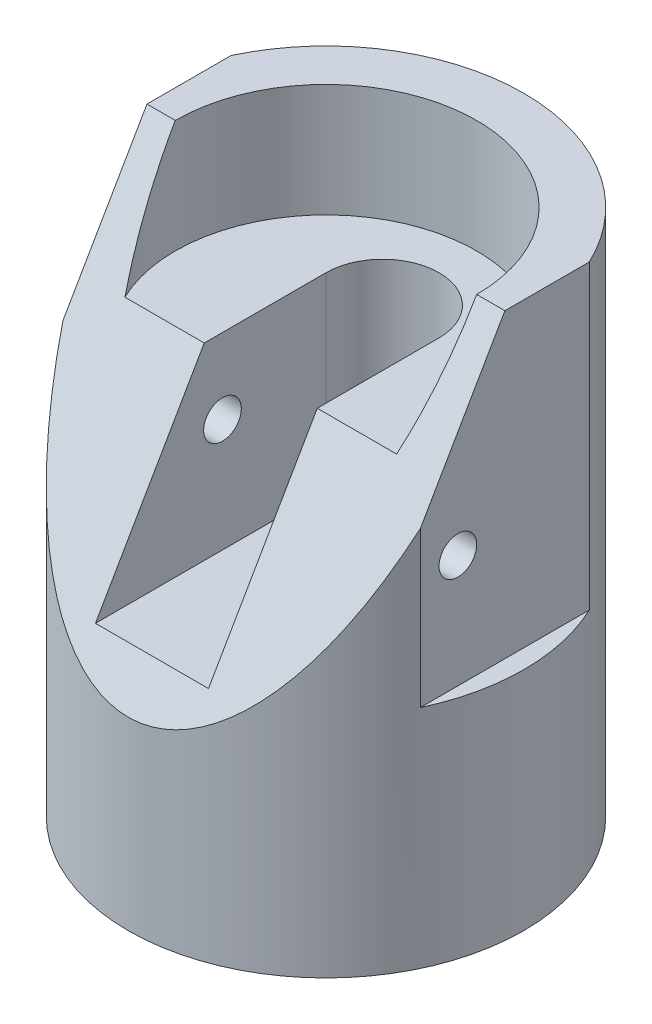
ISO-10303-21;
HEADER;
FILE_DESCRIPTION(('STEP AP214'),'2;1');
FILE_NAME('part.step','',(''),(''),'','','');
FILE_SCHEMA(('AUTOMOTIVE_DESIGN { 1 0 10303 214 1 1 1 1 }'));
ENDSEC;
DATA;
#1=APPLICATION_CONTEXT('core data for automotive mechanical design processes');
#2=APPLICATION_PROTOCOL_DEFINITION('international standard','automotive_design',2000,#1);
#3=PRODUCT_CONTEXT('',#1,'mechanical');
#4=PRODUCT('Part','Part','',(#3));
#5=PRODUCT_RELATED_PRODUCT_CATEGORY('part','',(#4));
#6=PRODUCT_DEFINITION_FORMATION('','',#4);
#7=PRODUCT_DEFINITION_CONTEXT('part definition',#1,'design');
#8=PRODUCT_DEFINITION('design','',#6,#7);
#9=PRODUCT_DEFINITION_SHAPE('','',#8);
#10=(LENGTH_UNIT() NAMED_UNIT(*) SI_UNIT(.MILLI.,.METRE.));
#11=(NAMED_UNIT(*) PLANE_ANGLE_UNIT() SI_UNIT($,.RADIAN.));
#12=(NAMED_UNIT(*) SI_UNIT($,.STERADIAN.) SOLID_ANGLE_UNIT());
#13=UNCERTAINTY_MEASURE_WITH_UNIT(LENGTH_MEASURE(1.E-05),#10,'distance_accuracy_value','');
#14=(GEOMETRIC_REPRESENTATION_CONTEXT(3) GLOBAL_UNCERTAINTY_ASSIGNED_CONTEXT((#13)) GLOBAL_UNIT_ASSIGNED_CONTEXT((#10,
#11,#12)) REPRESENTATION_CONTEXT('',''));
#15=CARTESIAN_POINT('',(0.,0.,0.));
#16=DIRECTION('',(0.,0.,1.));
#17=DIRECTION('',(1.,0.,0.));
#18=AXIS2_PLACEMENT_3D('',#15,#16,#17);
#19=CARTESIAN_POINT('',(33.3375,31.1577562026728,33.3375));
#20=DIRECTION('',(0.,-0.500000000000001,-0.866025403784438));
#21=DIRECTION('',(0.,0.866025403784438,-0.500000000000001));
#22=AXIS2_PLACEMENT_3D('',#19,#20,#21);
#23=PLANE('',#22);
#24=DIRECTION('',(-1.,0.,0.));
#25=VECTOR('',#24,1.);
#26=CARTESIAN_POINT('',(33.3375,88.9,0.));
#27=LINE('',#26,#25);
#28=CARTESIAN_POINT('',(-25.4,88.9,0.));
#29=VERTEX_POINT('',#28);
#30=CARTESIAN_POINT('',(-30.1752,88.9,0.));
#31=VERTEX_POINT('',#30);
#32=EDGE_CURVE('E191',#29,#31,#27,.T.);
#33=ORIENTED_EDGE('',*,*,#32,.T.);
#34=DIRECTION('',(0.,-0.866025403784438,0.500000000000001));
#35=VECTOR('',#34,1.);
#36=CARTESIAN_POINT('',(-30.1752,31.1577562026728,33.3375));
#37=LINE('',#36,#35);
#38=CARTESIAN_POINT('',(-30.1752,64.3533376274901,14.1720221284755));
#39=VERTEX_POINT('',#38);
#40=EDGE_CURVE('E153',#31,#39,#37,.T.);
#41=ORIENTED_EDGE('',*,*,#40,.T.);
#42=CARTESIAN_POINT('',(0.,88.9,0.));
#43=DIRECTION('',(0.,-0.500000000000001,-0.866025403784438));
#44=DIRECTION('',(0.,-0.866025403784438,0.500000000000001));
#45=AXIS2_PLACEMENT_3D('',#42,#43,#44);
#46=ELLIPSE('',#45,66.6749999999998,33.3375);
#47=CARTESIAN_POINT('',(30.1498,64.2598823332762,14.2259785677471));
#48=VERTEX_POINT('',#47);
#49=EDGE_CURVE('E135',#48,#39,#46,.T.);
#50=ORIENTED_EDGE('',*,*,#49,.F.);
#51=DIRECTION('',(0.,0.866025403784438,-0.500000000000001));
#52=VECTOR('',#51,1.);
#53=CARTESIAN_POINT('',(30.1498,31.1577562026728,33.3375));
#54=LINE('',#53,#52);
#55=CARTESIAN_POINT('',(30.1498,88.9,0.));
#56=VERTEX_POINT('',#55);
#57=EDGE_CURVE('E137',#48,#56,#54,.T.);
#58=ORIENTED_EDGE('',*,*,#57,.T.);
#59=CARTESIAN_POINT('',(25.4,88.9,0.));
#60=VERTEX_POINT('',#59);
#61=EDGE_CURVE('E195',#56,#60,#27,.T.);
#62=ORIENTED_EDGE('',*,*,#61,.T.);
#63=CARTESIAN_POINT('',(0.,88.9,0.));
#64=DIRECTION('',(0.,-0.500000000000001,-0.866025403784438));
#65=DIRECTION('',(0.,0.866025403784438,-0.500000000000001));
#66=AXIS2_PLACEMENT_3D('',#63,#64,#65);
#67=ELLIPSE('',#66,50.7999999999999,25.4);
#68=CARTESIAN_POINT('',(22.8952505991963,69.85,10.9985226280624));
#69=VERTEX_POINT('',#68);
#70=EDGE_CURVE('E187',#60,#69,#67,.T.);
#71=ORIENTED_EDGE('',*,*,#70,.T.);
#72=DIRECTION('',(1.,0.,0.));
#73=VECTOR('',#72,1.);
#74=CARTESIAN_POINT('',(33.3375,69.85,10.9985226280624));
#75=LINE('',#74,#73);
#76=CARTESIAN_POINT('',(9.525,69.85,10.9985226280624));
#77=VERTEX_POINT('',#76);
#78=EDGE_CURVE('E198',#77,#69,#75,.T.);
#79=ORIENTED_EDGE('',*,*,#78,.F.);
#80=DIRECTION('',(0.,-0.866025403784438,0.500000000000001));
#81=VECTOR('',#80,1.);
#82=CARTESIAN_POINT('',(9.525,31.1577562026728,33.3375));
#83=LINE('',#82,#81);
#84=CARTESIAN_POINT('',(9.525,38.1,29.3293936748331));
#85=VERTEX_POINT('',#84);
#86=EDGE_CURVE('E176',#77,#85,#83,.T.);
#87=ORIENTED_EDGE('',*,*,#86,.T.);
#88=DIRECTION('',(1.,0.,0.));
#89=VECTOR('',#88,1.);
#90=CARTESIAN_POINT('',(33.3375,38.1,29.3293936748331));
#91=LINE('',#90,#89);
#92=CARTESIAN_POINT('',(-9.525,38.1,29.3293936748331));
#93=VERTEX_POINT('',#92);
#94=EDGE_CURVE('E12',#93,#85,#91,.T.);
#95=ORIENTED_EDGE('',*,*,#94,.F.);
#96=DIRECTION('',(0.,0.866025403784438,-0.500000000000001));
#97=VECTOR('',#96,1.);
#98=CARTESIAN_POINT('',(-9.525,31.1577562026728,33.3375));
#99=LINE('',#98,#97);
#100=CARTESIAN_POINT('',(-9.525,69.85,10.9985226280624));
#101=VERTEX_POINT('',#100);
#102=EDGE_CURVE('E171',#93,#101,#99,.T.);
#103=ORIENTED_EDGE('',*,*,#102,.T.);
#104=CARTESIAN_POINT('',(-22.8952505991963,69.85,10.9985226280624));
#105=VERTEX_POINT('',#104);
#106=EDGE_CURVE('E199',#105,#101,#75,.T.);
#107=ORIENTED_EDGE('',*,*,#106,.F.);
#108=EDGE_CURVE('E183',#105,#29,#67,.T.);
#109=ORIENTED_EDGE('',*,*,#108,.T.);
#110=EDGE_LOOP('',(#33,#41,#50,#58,#62,#71,#79,#87,#95,#103,#107,#109));
#111=FACE_BOUND('',#110,.T.);
#112=ADVANCED_FACE('F37',(#111),#23,.F.);
#113=CARTESIAN_POINT('',(0.,88.9,0.));
#114=DIRECTION('',(0.,1.,0.));
#115=DIRECTION('',(0.,0.,1.));
#116=AXIS2_PLACEMENT_3D('',#113,#114,#115);
#117=PLANE('',#116);
#118=DIRECTION('',(0.,0.,-1.));
#119=VECTOR('',#118,1.);
#120=CARTESIAN_POINT('',(-30.1752,88.9,-14.1720221284755));
#121=LINE('',#120,#119);
#122=CARTESIAN_POINT('',(-30.1752,88.9,-14.1720221284755));
#123=VERTEX_POINT('',#122);
#124=EDGE_CURVE('E122',#31,#123,#121,.T.);
#125=ORIENTED_EDGE('',*,*,#124,.F.);
#126=ORIENTED_EDGE('',*,*,#32,.F.);
#127=CARTESIAN_POINT('',(0.,88.9,0.));
#128=DIRECTION('',(0.,1.,0.));
#129=DIRECTION('',(0.,0.,1.));
#130=AXIS2_PLACEMENT_3D('',#127,#128,#129);
#131=CIRCLE('',#130,25.4);
#132=EDGE_CURVE('E179',#60,#29,#131,.T.);
#133=ORIENTED_EDGE('',*,*,#132,.F.);
#134=ORIENTED_EDGE('',*,*,#61,.F.);
#135=DIRECTION('',(0.,0.,1.));
#136=VECTOR('',#135,1.);
#137=CARTESIAN_POINT('',(30.1498,88.9,-14.2259785677471));
#138=LINE('',#137,#136);
#139=CARTESIAN_POINT('',(30.1498,88.9,-14.2259785677471));
#140=VERTEX_POINT('',#139);
#141=EDGE_CURVE('E143',#140,#56,#138,.T.);
#142=ORIENTED_EDGE('',*,*,#141,.F.);
#143=CARTESIAN_POINT('',(0.,88.9,0.));
#144=DIRECTION('',(0.,-1.,0.));
#145=DIRECTION('',(0.,0.,-1.));
#146=AXIS2_PLACEMENT_3D('',#143,#144,#145);
#147=CIRCLE('',#146,33.3375);
#148=EDGE_CURVE('E188',#123,#140,#147,.T.);
#149=ORIENTED_EDGE('',*,*,#148,.F.);
#150=EDGE_LOOP('',(#125,#126,#133,#134,#142,#149));
#151=FACE_BOUND('',#150,.T.);
#152=ADVANCED_FACE('F236',(#151),#117,.T.);
#153=CARTESIAN_POINT('',(0.,88.9,0.));
#154=DIRECTION('',(0.,-1.,0.));
#155=DIRECTION('',(0.,0.,-1.));
#156=AXIS2_PLACEMENT_3D('',#153,#154,#155);
#157=CYLINDRICAL_SURFACE('',#156,33.3375);
#158=DIRECTION('',(0.,1.,0.));
#159=VECTOR('',#158,1.);
#160=CARTESIAN_POINT('',(-30.1752,38.1,14.1720221284755));
#161=LINE('',#160,#159);
#162=CARTESIAN_POINT('',(-30.1752,38.1,14.1720221284755));
#163=VERTEX_POINT('',#162);
#164=EDGE_CURVE('E126',#163,#39,#161,.T.);
#165=ORIENTED_EDGE('',*,*,#164,.F.);
#166=CARTESIAN_POINT('',(0.,38.1,0.));
#167=DIRECTION('',(0.,1.,0.));
#168=DIRECTION('',(0.,0.,1.));
#169=AXIS2_PLACEMENT_3D('',#166,#167,#168);
#170=CIRCLE('',#169,33.3375);
#171=CARTESIAN_POINT('',(-30.1752,38.1,-14.1720221284755));
#172=VERTEX_POINT('',#171);
#173=EDGE_CURVE('E117',#172,#163,#170,.T.);
#174=ORIENTED_EDGE('',*,*,#173,.F.);
#175=DIRECTION('',(0.,1.,0.));
#176=VECTOR('',#175,1.);
#177=CARTESIAN_POINT('',(-30.1752,38.1,-14.1720221284755));
#178=LINE('',#177,#176);
#179=EDGE_CURVE('E128',#172,#123,#178,.T.);
#180=ORIENTED_EDGE('',*,*,#179,.T.);
#181=ORIENTED_EDGE('',*,*,#148,.T.);
#182=DIRECTION('',(0.,1.,0.));
#183=VECTOR('',#182,1.);
#184=CARTESIAN_POINT('',(30.1498,38.1,-14.2259785677471));
#185=LINE('',#184,#183);
#186=CARTESIAN_POINT('',(30.1498,38.1,-14.2259785677471));
#187=VERTEX_POINT('',#186);
#188=EDGE_CURVE('E145',#187,#140,#185,.T.);
#189=ORIENTED_EDGE('',*,*,#188,.F.);
#190=CARTESIAN_POINT('',(0.,38.1,0.));
#191=DIRECTION('',(0.,1.,0.));
#192=DIRECTION('',(0.,0.,1.));
#193=AXIS2_PLACEMENT_3D('',#190,#191,#192);
#194=CIRCLE('',#193,33.3375);
#195=CARTESIAN_POINT('',(30.1498,38.1,14.2259785677471));
#196=VERTEX_POINT('',#195);
#197=EDGE_CURVE('E141',#196,#187,#194,.T.);
#198=ORIENTED_EDGE('',*,*,#197,.F.);
#199=DIRECTION('',(0.,1.,0.));
#200=VECTOR('',#199,1.);
#201=CARTESIAN_POINT('',(30.1498,38.1,14.2259785677471));
#202=LINE('',#201,#200);
#203=EDGE_CURVE('E148',#196,#48,#202,.T.);
#204=ORIENTED_EDGE('',*,*,#203,.T.);
#205=ORIENTED_EDGE('',*,*,#49,.T.);
#206=EDGE_LOOP('',(#165,#174,#180,#181,#189,#198,#204,#205));
#207=FACE_BOUND('',#206,.T.);
#208=CARTESIAN_POINT('',(0.,0.,0.));
#209=DIRECTION('',(0.,-1.,0.));
#210=DIRECTION('',(0.,0.,-1.));
#211=AXIS2_PLACEMENT_3D('',#208,#209,#210);
#212=CIRCLE('',#211,33.3375);
#213=CARTESIAN_POINT('',(0.,0.,-33.3375));
#214=VERTEX_POINT('',#213);
#215=EDGE_CURVE('E192',#214,#214,#212,.T.);
#216=ORIENTED_EDGE('',*,*,#215,.F.);
#217=EDGE_LOOP('',(#216));
#218=FACE_BOUND('',#217,.T.);
#219=ADVANCED_FACE('F131',(#207,#218),#157,.T.);
#220=CARTESIAN_POINT('',(0.,0.,0.));
#221=DIRECTION('',(0.,1.,0.));
#222=DIRECTION('',(0.,0.,1.));
#223=AXIS2_PLACEMENT_3D('',#220,#221,#222);
#224=PLANE('',#223);
#225=ORIENTED_EDGE('',*,*,#215,.T.);
#226=EDGE_LOOP('',(#225));
#227=FACE_BOUND('',#226,.T.);
#228=ADVANCED_FACE('F39',(#227),#224,.F.);
#229=CARTESIAN_POINT('',(0.,69.85,0.));
#230=DIRECTION('',(0.,1.,0.));
#231=DIRECTION('',(0.,0.,1.));
#232=AXIS2_PLACEMENT_3D('',#229,#230,#231);
#233=PLANE('',#232);
#234=DIRECTION('',(0.,0.,-1.));
#235=VECTOR('',#234,1.);
#236=CARTESIAN_POINT('',(9.525,69.85,0.));
#237=LINE('',#236,#235);
#238=CARTESIAN_POINT('',(9.525,69.85,-9.525));
#239=VERTEX_POINT('',#238);
#240=EDGE_CURVE('E45',#77,#239,#237,.T.);
#241=ORIENTED_EDGE('',*,*,#240,.F.);
#242=ORIENTED_EDGE('',*,*,#78,.T.);
#243=CARTESIAN_POINT('',(0.,69.85,0.));
#244=DIRECTION('',(0.,1.,0.));
#245=DIRECTION('',(0.,0.,1.));
#246=AXIS2_PLACEMENT_3D('',#243,#244,#245);
#247=CIRCLE('',#246,25.4);
#248=EDGE_CURVE('E180',#69,#105,#247,.T.);
#249=ORIENTED_EDGE('',*,*,#248,.T.);
#250=ORIENTED_EDGE('',*,*,#106,.T.);
#251=DIRECTION('',(0.,0.,1.));
#252=VECTOR('',#251,1.);
#253=CARTESIAN_POINT('',(-9.525,69.85,-9.525));
#254=LINE('',#253,#252);
#255=CARTESIAN_POINT('',(-9.525,69.85,-9.525));
#256=VERTEX_POINT('',#255);
#257=EDGE_CURVE('E160',#256,#101,#254,.T.);
#258=ORIENTED_EDGE('',*,*,#257,.F.);
#259=CARTESIAN_POINT('',(0.,69.85,-9.525));
#260=DIRECTION('',(0.,1.,0.));
#261=DIRECTION('',(0.,0.,1.));
#262=AXIS2_PLACEMENT_3D('',#259,#260,#261);
#263=CIRCLE('',#262,9.525);
#264=EDGE_CURVE('E155',#239,#256,#263,.T.);
#265=ORIENTED_EDGE('',*,*,#264,.F.);
#266=EDGE_LOOP('',(#241,#242,#249,#250,#258,#265));
#267=FACE_BOUND('',#266,.T.);
#268=ADVANCED_FACE('F213',(#267),#233,.T.);
#269=CARTESIAN_POINT('',(0.,69.85,0.));
#270=DIRECTION('',(0.,1.,0.));
#271=DIRECTION('',(0.,0.,1.));
#272=AXIS2_PLACEMENT_3D('',#269,#270,#271);
#273=CYLINDRICAL_SURFACE('',#272,25.4);
#274=ORIENTED_EDGE('',*,*,#132,.T.);
#275=ORIENTED_EDGE('',*,*,#108,.F.);
#276=ORIENTED_EDGE('',*,*,#248,.F.);
#277=ORIENTED_EDGE('',*,*,#70,.F.);
#278=EDGE_LOOP('',(#274,#275,#276,#277));
#279=FACE_BOUND('',#278,.T.);
#280=ADVANCED_FACE('F224',(#279),#273,.F.);
#281=CARTESIAN_POINT('',(0.,38.1,-9.525));
#282=DIRECTION('',(0.,1.,0.));
#283=DIRECTION('',(0.,0.,1.));
#284=AXIS2_PLACEMENT_3D('',#281,#282,#283);
#285=PLANE('',#284);
#286=ORIENTED_EDGE('',*,*,#94,.T.);
#287=DIRECTION('',(0.,0.,-1.));
#288=VECTOR('',#287,1.);
#289=CARTESIAN_POINT('',(9.525,38.1,-9.525));
#290=LINE('',#289,#288);
#291=CARTESIAN_POINT('',(9.525,38.1,-9.525));
#292=VERTEX_POINT('',#291);
#293=EDGE_CURVE('E163',#85,#292,#290,.T.);
#294=ORIENTED_EDGE('',*,*,#293,.T.);
#295=CARTESIAN_POINT('',(0.,38.1,-9.525));
#296=DIRECTION('',(0.,1.,0.));
#297=DIRECTION('',(0.,0.,1.));
#298=AXIS2_PLACEMENT_3D('',#295,#296,#297);
#299=CIRCLE('',#298,9.525);
#300=CARTESIAN_POINT('',(-9.525,38.1,-9.525));
#301=VERTEX_POINT('',#300);
#302=EDGE_CURVE('E156',#292,#301,#299,.T.);
#303=ORIENTED_EDGE('',*,*,#302,.T.);
#304=DIRECTION('',(0.,0.,1.));
#305=VECTOR('',#304,1.);
#306=CARTESIAN_POINT('',(-9.525,38.1,-9.525));
#307=LINE('',#306,#305);
#308=EDGE_CURVE('E159',#301,#93,#307,.T.);
#309=ORIENTED_EDGE('',*,*,#308,.T.);
#310=EDGE_LOOP('',(#286,#294,#303,#309));
#311=FACE_BOUND('',#310,.T.);
#312=ADVANCED_FACE('F222',(#311),#285,.T.);
#313=CARTESIAN_POINT('',(9.525,38.1,-9.525));
#314=DIRECTION('',(1.,0.,0.));
#315=DIRECTION('',(0.,0.,-1.));
#316=AXIS2_PLACEMENT_3D('',#313,#314,#315);
#317=PLANE('',#316);
#318=CARTESIAN_POINT('',(9.525,57.15,7.9248));
#319=DIRECTION('',(1.,0.,0.));
#320=DIRECTION('',(0.,0.,-1.));
#321=AXIS2_PLACEMENT_3D('',#318,#319,#320);
#322=CIRCLE('',#321,3.175);
#323=CARTESIAN_POINT('',(9.525,57.15,11.0998));
#324=VERTEX_POINT('',#323);
#325=EDGE_CURVE('E147',#324,#324,#322,.T.);
#326=ORIENTED_EDGE('',*,*,#325,.T.);
#327=EDGE_LOOP('',(#326));
#328=FACE_BOUND('',#327,.T.);
#329=ORIENTED_EDGE('',*,*,#240,.T.);
#330=DIRECTION('',(0.,1.,0.));
#331=VECTOR('',#330,1.);
#332=CARTESIAN_POINT('',(9.525,38.1,-9.525));
#333=LINE('',#332,#331);
#334=EDGE_CURVE('E168',#292,#239,#333,.T.);
#335=ORIENTED_EDGE('',*,*,#334,.F.);
#336=ORIENTED_EDGE('',*,*,#293,.F.);
#337=ORIENTED_EDGE('',*,*,#86,.F.);
#338=EDGE_LOOP('',(#329,#335,#336,#337));
#339=FACE_BOUND('',#338,.T.);
#340=ADVANCED_FACE('F204',(#328,#339),#317,.F.);
#341=CARTESIAN_POINT('',(-9.525,38.1,-9.525));
#342=DIRECTION('',(-1.,0.,0.));
#343=DIRECTION('',(0.,0.,1.));
#344=AXIS2_PLACEMENT_3D('',#341,#342,#343);
#345=PLANE('',#344);
#346=CARTESIAN_POINT('',(-9.525,57.15,7.9248));
#347=DIRECTION('',(-1.,0.,0.));
#348=DIRECTION('',(0.,0.,1.));
#349=AXIS2_PLACEMENT_3D('',#346,#347,#348);
#350=CIRCLE('',#349,3.175);
#351=CARTESIAN_POINT('',(-9.525,57.15,11.0998));
#352=VERTEX_POINT('',#351);
#353=EDGE_CURVE('E256',#352,#352,#350,.T.);
#354=ORIENTED_EDGE('',*,*,#353,.T.);
#355=EDGE_LOOP('',(#354));
#356=FACE_BOUND('',#355,.T.);
#357=ORIENTED_EDGE('',*,*,#308,.F.);
#358=DIRECTION('',(0.,1.,0.));
#359=VECTOR('',#358,1.);
#360=CARTESIAN_POINT('',(-9.525,38.1,-9.525));
#361=LINE('',#360,#359);
#362=EDGE_CURVE('E165',#301,#256,#361,.T.);
#363=ORIENTED_EDGE('',*,*,#362,.T.);
#364=ORIENTED_EDGE('',*,*,#257,.T.);
#365=ORIENTED_EDGE('',*,*,#102,.F.);
#366=EDGE_LOOP('',(#357,#363,#364,#365));
#367=FACE_BOUND('',#366,.T.);
#368=ADVANCED_FACE('F217',(#356,#367),#345,.F.);
#369=CARTESIAN_POINT('',(0.,38.1,-9.525));
#370=DIRECTION('',(0.,1.,0.));
#371=DIRECTION('',(0.,0.,1.));
#372=AXIS2_PLACEMENT_3D('',#369,#370,#371);
#373=CYLINDRICAL_SURFACE('',#372,9.525);
#374=ORIENTED_EDGE('',*,*,#264,.T.);
#375=ORIENTED_EDGE('',*,*,#362,.F.);
#376=ORIENTED_EDGE('',*,*,#302,.F.);
#377=ORIENTED_EDGE('',*,*,#334,.T.);
#378=EDGE_LOOP('',(#374,#375,#376,#377));
#379=FACE_BOUND('',#378,.T.);
#380=ADVANCED_FACE('F211',(#379),#373,.F.);
#381=CARTESIAN_POINT('',(30.1498,38.1,-14.2259785677471));
#382=DIRECTION('',(-1.,0.,0.));
#383=DIRECTION('',(0.,0.,1.));
#384=AXIS2_PLACEMENT_3D('',#381,#382,#383);
#385=PLANE('',#384);
#386=CARTESIAN_POINT('',(30.1498,57.15,7.92479999999999));
#387=DIRECTION('',(-1.,0.,0.));
#388=DIRECTION('',(0.,0.,1.));
#389=AXIS2_PLACEMENT_3D('',#386,#387,#388);
#390=CIRCLE('',#389,3.175);
#391=CARTESIAN_POINT('',(30.1498,57.15,11.0998));
#392=VERTEX_POINT('',#391);
#393=EDGE_CURVE('E258',#392,#392,#390,.T.);
#394=ORIENTED_EDGE('',*,*,#393,.T.);
#395=EDGE_LOOP('',(#394));
#396=FACE_BOUND('',#395,.T.);
#397=ORIENTED_EDGE('',*,*,#203,.F.);
#398=DIRECTION('',(0.,0.,1.));
#399=VECTOR('',#398,1.);
#400=CARTESIAN_POINT('',(30.1498,38.1,-14.2259785677471));
#401=LINE('',#400,#399);
#402=EDGE_CURVE('E58',#187,#196,#401,.T.);
#403=ORIENTED_EDGE('',*,*,#402,.F.);
#404=ORIENTED_EDGE('',*,*,#188,.T.);
#405=ORIENTED_EDGE('',*,*,#141,.T.);
#406=ORIENTED_EDGE('',*,*,#57,.F.);
#407=EDGE_LOOP('',(#397,#403,#404,#405,#406));
#408=FACE_BOUND('',#407,.T.);
#409=ADVANCED_FACE('F249',(#396,#408),#385,.F.);
#410=CARTESIAN_POINT('',(0.,38.1,0.));
#411=DIRECTION('',(0.,1.,0.));
#412=DIRECTION('',(0.,0.,1.));
#413=AXIS2_PLACEMENT_3D('',#410,#411,#412);
#414=PLANE('',#413);
#415=ORIENTED_EDGE('',*,*,#197,.T.);
#416=ORIENTED_EDGE('',*,*,#402,.T.);
#417=EDGE_LOOP('',(#415,#416));
#418=FACE_BOUND('',#417,.T.);
#419=ADVANCED_FACE('F278',(#418),#414,.T.);
#420=CARTESIAN_POINT('',(-30.1752,38.1,-14.1720221284755));
#421=DIRECTION('',(1.,0.,0.));
#422=DIRECTION('',(0.,0.,-1.));
#423=AXIS2_PLACEMENT_3D('',#420,#421,#422);
#424=PLANE('',#423);
#425=CARTESIAN_POINT('',(-30.1752,57.15,7.92480000000001));
#426=DIRECTION('',(-1.,0.,0.));
#427=DIRECTION('',(0.,0.,1.));
#428=AXIS2_PLACEMENT_3D('',#425,#426,#427);
#429=CIRCLE('',#428,3.175);
#430=CARTESIAN_POINT('',(-30.1752,57.15,11.0998));
#431=VERTEX_POINT('',#430);
#432=EDGE_CURVE('E263',#431,#431,#429,.T.);
#433=ORIENTED_EDGE('',*,*,#432,.F.);
#434=EDGE_LOOP('',(#433));
#435=FACE_BOUND('',#434,.T.);
#436=ORIENTED_EDGE('',*,*,#124,.T.);
#437=ORIENTED_EDGE('',*,*,#179,.F.);
#438=DIRECTION('',(0.,0.,-1.));
#439=VECTOR('',#438,1.);
#440=CARTESIAN_POINT('',(-30.1752,38.1,-14.1720221284755));
#441=LINE('',#440,#439);
#442=EDGE_CURVE('E51',#163,#172,#441,.T.);
#443=ORIENTED_EDGE('',*,*,#442,.F.);
#444=ORIENTED_EDGE('',*,*,#164,.T.);
#445=ORIENTED_EDGE('',*,*,#40,.F.);
#446=EDGE_LOOP('',(#436,#437,#443,#444,#445));
#447=FACE_BOUND('',#446,.T.);
#448=ADVANCED_FACE('F125',(#435,#447),#424,.F.);
#449=CARTESIAN_POINT('',(0.,38.1,0.));
#450=DIRECTION('',(0.,1.,0.));
#451=DIRECTION('',(0.,0.,1.));
#452=AXIS2_PLACEMENT_3D('',#449,#450,#451);
#453=PLANE('',#452);
#454=ORIENTED_EDGE('',*,*,#173,.T.);
#455=ORIENTED_EDGE('',*,*,#442,.T.);
#456=EDGE_LOOP('',(#454,#455));
#457=FACE_BOUND('',#456,.T.);
#458=ADVANCED_FACE('F118',(#457),#453,.T.);
#459=CARTESIAN_POINT('',(30.1498,57.15,7.92479999999999));
#460=DIRECTION('',(-1.,0.,0.));
#461=DIRECTION('',(0.,0.,1.));
#462=AXIS2_PLACEMENT_3D('',#459,#460,#461);
#463=CYLINDRICAL_SURFACE('',#462,3.175);
#464=CARTESIAN_POINT('',(-30.1752,57.15,11.0998));
#465=CARTESIAN_POINT('',(-29.96009375,57.15,11.0998));
#466=CARTESIAN_POINT('',(-29.7449875,57.15,11.0998));
#467=CARTESIAN_POINT('',(-29.314775,57.15,11.0998));
#468=CARTESIAN_POINT('',(-29.09966875,57.15,11.0998));
#469=CARTESIAN_POINT('',(-28.66945625,57.15,11.0998));
#470=CARTESIAN_POINT('',(-28.45435,57.15,11.0998));
#471=CARTESIAN_POINT('',(-28.0241375,57.15,11.0998));
#472=CARTESIAN_POINT('',(-27.80903125,57.15,11.0998));
#473=CARTESIAN_POINT('',(-27.37881875,57.15,11.0998));
#474=CARTESIAN_POINT('',(-27.1637125,57.15,11.0998));
#475=CARTESIAN_POINT('',(-26.7335,57.15,11.0998));
#476=CARTESIAN_POINT('',(-26.51839375,57.15,11.0998));
#477=CARTESIAN_POINT('',(-26.08818125,57.15,11.0998));
#478=CARTESIAN_POINT('',(-25.873075,57.15,11.0998));
#479=CARTESIAN_POINT('',(-25.4428625,57.15,11.0998));
#480=CARTESIAN_POINT('',(-25.22775625,57.15,11.0998));
#481=CARTESIAN_POINT('',(-24.79754375,57.15,11.0998));
#482=CARTESIAN_POINT('',(-24.5824375,57.15,11.0998));
#483=CARTESIAN_POINT('',(-24.152225,57.15,11.0998));
#484=CARTESIAN_POINT('',(-23.93711875,57.15,11.0998));
#485=CARTESIAN_POINT('',(-23.50690625,57.15,11.0998));
#486=CARTESIAN_POINT('',(-23.2918,57.15,11.0998));
#487=CARTESIAN_POINT('',(-22.8615875,57.15,11.0998));
#488=CARTESIAN_POINT('',(-22.64648125,57.15,11.0998));
#489=CARTESIAN_POINT('',(-22.21626875,57.15,11.0998));
#490=CARTESIAN_POINT('',(-22.0011625,57.15,11.0998));
#491=CARTESIAN_POINT('',(-21.57095,57.15,11.0998));
#492=CARTESIAN_POINT('',(-21.35584375,57.15,11.0998));
#493=CARTESIAN_POINT('',(-20.92563125,57.15,11.0998));
#494=CARTESIAN_POINT('',(-20.710525,57.15,11.0998));
#495=CARTESIAN_POINT('',(-20.2803125,57.15,11.0998));
#496=CARTESIAN_POINT('',(-20.06520625,57.15,11.0998));
#497=CARTESIAN_POINT('',(-19.63499375,57.15,11.0998));
#498=CARTESIAN_POINT('',(-19.4198875,57.15,11.0998));
#499=CARTESIAN_POINT('',(-18.989675,57.15,11.0998));
#500=CARTESIAN_POINT('',(-18.77456875,57.15,11.0998));
#501=CARTESIAN_POINT('',(-18.34435625,57.15,11.0998));
#502=CARTESIAN_POINT('',(-18.12925,57.15,11.0998));
#503=CARTESIAN_POINT('',(-17.6990375,57.15,11.0998));
#504=CARTESIAN_POINT('',(-17.48393125,57.15,11.0998));
#505=CARTESIAN_POINT('',(-17.05371875,57.15,11.0998));
#506=CARTESIAN_POINT('',(-16.8386125,57.15,11.0998));
#507=CARTESIAN_POINT('',(-16.4084,57.15,11.0998));
#508=CARTESIAN_POINT('',(-16.19329375,57.15,11.0998));
#509=CARTESIAN_POINT('',(-15.76308125,57.15,11.0998));
#510=CARTESIAN_POINT('',(-15.547975,57.15,11.0998));
#511=CARTESIAN_POINT('',(-15.1177625,57.15,11.0998));
#512=CARTESIAN_POINT('',(-14.90265625,57.15,11.0998));
#513=CARTESIAN_POINT('',(-14.47244375,57.15,11.0998));
#514=CARTESIAN_POINT('',(-14.2573375,57.15,11.0998));
#515=CARTESIAN_POINT('',(-13.827125,57.15,11.0998));
#516=CARTESIAN_POINT('',(-13.61201875,57.15,11.0998));
#517=CARTESIAN_POINT('',(-13.18180625,57.15,11.0998));
#518=CARTESIAN_POINT('',(-12.9667,57.15,11.0998));
#519=CARTESIAN_POINT('',(-12.5364875,57.15,11.0998));
#520=CARTESIAN_POINT('',(-12.32138125,57.15,11.0998));
#521=CARTESIAN_POINT('',(-11.89116875,57.15,11.0998));
#522=CARTESIAN_POINT('',(-11.6760625,57.15,11.0998));
#523=CARTESIAN_POINT('',(-11.24585,57.15,11.0998));
#524=CARTESIAN_POINT('',(-11.03074375,57.15,11.0998));
#525=CARTESIAN_POINT('',(-10.60053125,57.15,11.0998));
#526=CARTESIAN_POINT('',(-10.385425,57.15,11.0998));
#527=CARTESIAN_POINT('',(-9.9552125,57.15,11.0998));
#528=CARTESIAN_POINT('',(-9.74010625,57.15,11.0998));
#529=CARTESIAN_POINT('',(-9.525,57.15,11.0998));
#530=B_SPLINE_CURVE_WITH_KNOTS('',3,(#464,#465,#466,#467,#468,#469,#470,#471,#472,#473,#474,
#475,#476,#477,#478,#479,#480,#481,#482,#483,#484,#485,#486,#487,#488,#489,#490,#491,#492,#493,
#494,#495,#496,#497,#498,#499,#500,#501,#502,#503,#504,#505,#506,#507,#508,#509,#510,#511,#512,
#513,#514,#515,#516,#517,#518,#519,#520,#521,#522,#523,#524,#525,#526,#527,#528,#529),
.UNSPECIFIED.,.F.,.F.,(4,2,2,2,2,2,2,2,2,2,2,2,2,2,2,2,2,2,2,2,2,2,2,2,2,2,2,2,2,2,2,2,4),(0.,
0.645318749999998,1.2906375,1.93595625,2.581275,3.22659375,3.8719125,4.51723125,5.16255,
5.80786875,6.4531875,7.09850625,7.743825,8.38914375,9.03446249999999,9.67978125,10.3251,
10.97041875,11.6157375,12.26105625,12.906375,13.55169375,14.1970125,14.84233125,15.48765,
16.13296875,16.7782875,17.42360625,18.068925,18.71424375,19.3595625,20.00488125,20.6502),.UNSPECIFIED.);
#531=EDGE_CURVE('BSEAM291',#431,#352,#530,.T.);
#532=ORIENTED_EDGE('',*,*,#432,.T.);
#533=ORIENTED_EDGE('',*,*,#353,.F.);
#534=ORIENTED_EDGE('',*,*,#531,.T.);
#535=ORIENTED_EDGE('',*,*,#531,.F.);
#536=EDGE_LOOP('',(#532,#534,#533,#535));
#537=FACE_BOUND('',#536,.T.);
#538=ADVANCED_FACE('F291',(#537),#463,.F.);
#539=CARTESIAN_POINT('',(30.1498,57.15,11.0998));
#540=CARTESIAN_POINT('',(29.9349583333333,57.15,11.0998));
#541=CARTESIAN_POINT('',(29.7201166666667,57.15,11.0998));
#542=CARTESIAN_POINT('',(29.2904333333333,57.15,11.0998));
#543=CARTESIAN_POINT('',(29.0755916666667,57.15,11.0998));
#544=CARTESIAN_POINT('',(28.6459083333333,57.15,11.0998));
#545=CARTESIAN_POINT('',(28.4310666666667,57.15,11.0998));
#546=CARTESIAN_POINT('',(28.0013833333333,57.15,11.0998));
#547=CARTESIAN_POINT('',(27.7865416666667,57.15,11.0998));
#548=CARTESIAN_POINT('',(27.3568583333333,57.15,11.0998));
#549=CARTESIAN_POINT('',(27.1420166666667,57.15,11.0998));
#550=CARTESIAN_POINT('',(26.7123333333333,57.15,11.0998));
#551=CARTESIAN_POINT('',(26.4974916666667,57.15,11.0998));
#552=CARTESIAN_POINT('',(26.0678083333333,57.15,11.0998));
#553=CARTESIAN_POINT('',(25.8529666666667,57.15,11.0998));
#554=CARTESIAN_POINT('',(25.4232833333333,57.15,11.0998));
#555=CARTESIAN_POINT('',(25.2084416666667,57.15,11.0998));
#556=CARTESIAN_POINT('',(24.7787583333333,57.15,11.0998));
#557=CARTESIAN_POINT('',(24.5639166666667,57.15,11.0998));
#558=CARTESIAN_POINT('',(24.1342333333333,57.15,11.0998));
#559=CARTESIAN_POINT('',(23.9193916666667,57.15,11.0998));
#560=CARTESIAN_POINT('',(23.4897083333333,57.15,11.0998));
#561=CARTESIAN_POINT('',(23.2748666666667,57.15,11.0998));
#562=CARTESIAN_POINT('',(22.8451833333333,57.15,11.0998));
#563=CARTESIAN_POINT('',(22.6303416666667,57.15,11.0998));
#564=CARTESIAN_POINT('',(22.2006583333333,57.15,11.0998));
#565=CARTESIAN_POINT('',(21.9858166666667,57.15,11.0998));
#566=CARTESIAN_POINT('',(21.5561333333333,57.15,11.0998));
#567=CARTESIAN_POINT('',(21.3412916666667,57.15,11.0998));
#568=CARTESIAN_POINT('',(20.9116083333333,57.15,11.0998));
#569=CARTESIAN_POINT('',(20.6967666666667,57.15,11.0998));
#570=CARTESIAN_POINT('',(20.2670833333333,57.15,11.0998));
#571=CARTESIAN_POINT('',(20.0522416666667,57.15,11.0998));
#572=CARTESIAN_POINT('',(19.6225583333333,57.15,11.0998));
#573=CARTESIAN_POINT('',(19.4077166666667,57.15,11.0998));
#574=CARTESIAN_POINT('',(18.9780333333333,57.15,11.0998));
#575=CARTESIAN_POINT('',(18.7631916666667,57.15,11.0998));
#576=CARTESIAN_POINT('',(18.3335083333333,57.15,11.0998));
#577=CARTESIAN_POINT('',(18.1186666666667,57.15,11.0998));
#578=CARTESIAN_POINT('',(17.6889833333333,57.15,11.0998));
#579=CARTESIAN_POINT('',(17.4741416666667,57.15,11.0998));
#580=CARTESIAN_POINT('',(17.0444583333333,57.15,11.0998));
#581=CARTESIAN_POINT('',(16.8296166666667,57.15,11.0998));
#582=CARTESIAN_POINT('',(16.3999333333333,57.15,11.0998));
#583=CARTESIAN_POINT('',(16.1850916666667,57.15,11.0998));
#584=CARTESIAN_POINT('',(15.7554083333333,57.15,11.0998));
#585=CARTESIAN_POINT('',(15.5405666666667,57.15,11.0998));
#586=CARTESIAN_POINT('',(15.1108833333333,57.15,11.0998));
#587=CARTESIAN_POINT('',(14.8960416666667,57.15,11.0998));
#588=CARTESIAN_POINT('',(14.4663583333333,57.15,11.0998));
#589=CARTESIAN_POINT('',(14.2515166666667,57.15,11.0998));
#590=CARTESIAN_POINT('',(13.8218333333333,57.15,11.0998));
#591=CARTESIAN_POINT('',(13.6069916666667,57.15,11.0998));
#592=CARTESIAN_POINT('',(13.1773083333333,57.15,11.0998));
#593=CARTESIAN_POINT('',(12.9624666666667,57.15,11.0998));
#594=CARTESIAN_POINT('',(12.5327833333333,57.15,11.0998));
#595=CARTESIAN_POINT('',(12.3179416666667,57.15,11.0998));
#596=CARTESIAN_POINT('',(11.8882583333333,57.15,11.0998));
#597=CARTESIAN_POINT('',(11.6734166666667,57.15,11.0998));
#598=CARTESIAN_POINT('',(11.2437333333333,57.15,11.0998));
#599=CARTESIAN_POINT('',(11.0288916666667,57.15,11.0998));
#600=CARTESIAN_POINT('',(10.5992083333333,57.15,11.0998));
#601=CARTESIAN_POINT('',(10.3843666666667,57.15,11.0998));
#602=CARTESIAN_POINT('',(9.95468333333333,57.15,11.0998));
#603=CARTESIAN_POINT('',(9.73984166666666,57.15,11.0998));
#604=CARTESIAN_POINT('',(9.525,57.15,11.0998));
#605=B_SPLINE_CURVE_WITH_KNOTS('',3,(#539,#540,#541,#542,#543,#544,#545,#546,#547,#548,#549,
#550,#551,#552,#553,#554,#555,#556,#557,#558,#559,#560,#561,#562,#563,#564,#565,#566,#567,#568,
#569,#570,#571,#572,#573,#574,#575,#576,#577,#578,#579,#580,#581,#582,#583,#584,#585,#586,#587,
#588,#589,#590,#591,#592,#593,#594,#595,#596,#597,#598,#599,#600,#601,#602,#603,#604),
.UNSPECIFIED.,.F.,.F.,(4,2,2,2,2,2,2,2,2,2,2,2,2,2,2,2,2,2,2,2,2,2,2,2,2,2,2,2,2,2,2,2,4),(0.,
0.644525000000003,1.28905,1.933575,2.5781,3.222625,3.86715,4.511675,5.1562,5.80072500000001,
6.44525000000001,7.08977500000001,7.73430000000001,8.37882500000001,9.02335000000001,
9.66787500000001,10.3124,10.956925,11.60145,12.245975,12.8905,13.535025,14.17955,14.824075,
15.4686,16.113125,16.75765,17.402175,18.0467,18.691225,19.33575,19.980275,20.6248),.UNSPECIFIED.);
#606=EDGE_CURVE('BSEAM292',#392,#324,#605,.T.);
#607=ORIENTED_EDGE('',*,*,#393,.F.);
#608=ORIENTED_EDGE('',*,*,#325,.F.);
#609=ORIENTED_EDGE('',*,*,#606,.T.);
#610=ORIENTED_EDGE('',*,*,#606,.F.);
#611=EDGE_LOOP('',(#607,#609,#608,#610));
#612=FACE_BOUND('',#611,.T.);
#613=ADVANCED_FACE('F292',(#612),#463,.F.);
#614=CLOSED_SHELL('',(#112,#152,#219,#228,#268,#280,#312,#340,#368,#380,#409,#419,#448,#458,
#538,#613));
#615=MANIFOLD_SOLID_BREP('B2',#614);
#616=ADVANCED_BREP_SHAPE_REPRESENTATION('',(#18,#615),#14);
#617=SHAPE_DEFINITION_REPRESENTATION(#9,#616);
ENDSEC;
END-ISO-10303-21;
